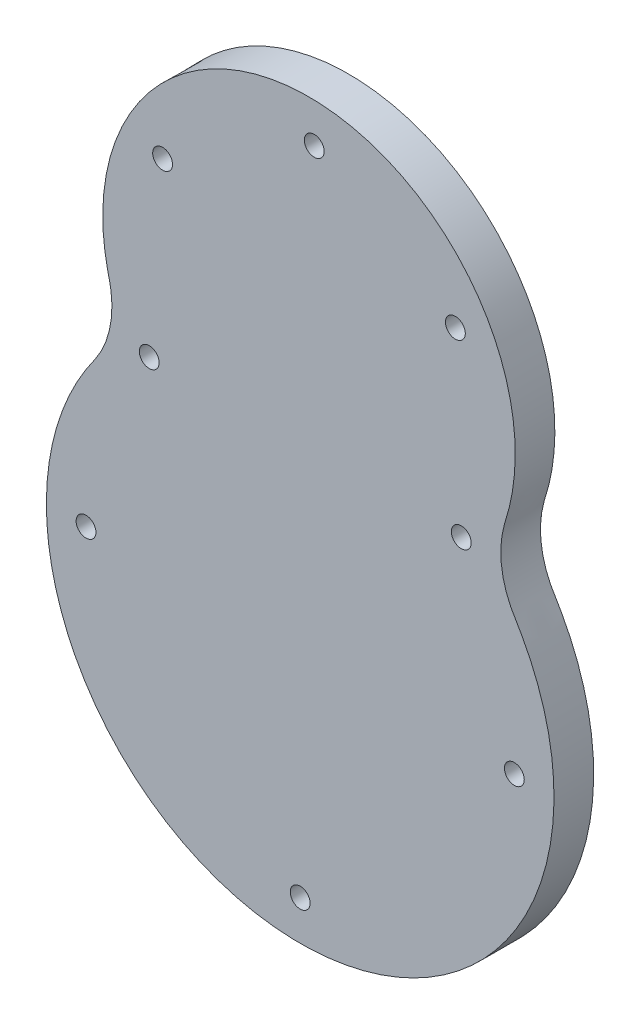
ISO-10303-21;
HEADER;
FILE_DESCRIPTION(('STEP AP214'),'2;1');
FILE_NAME('part.step','',(''),(''),'','','');
FILE_SCHEMA(('AUTOMOTIVE_DESIGN { 1 0 10303 214 1 1 1 1 }'));
ENDSEC;
DATA;
#1=APPLICATION_CONTEXT('core data for automotive mechanical design processes');
#2=APPLICATION_PROTOCOL_DEFINITION('international standard','automotive_design',2000,#1);
#3=PRODUCT_CONTEXT('',#1,'mechanical');
#4=PRODUCT('Part','Part','',(#3));
#5=PRODUCT_RELATED_PRODUCT_CATEGORY('part','',(#4));
#6=PRODUCT_DEFINITION_FORMATION('','',#4);
#7=PRODUCT_DEFINITION_CONTEXT('part definition',#1,'design');
#8=PRODUCT_DEFINITION('design','',#6,#7);
#9=PRODUCT_DEFINITION_SHAPE('','',#8);
#10=(LENGTH_UNIT() NAMED_UNIT(*) SI_UNIT(.MILLI.,.METRE.));
#11=(NAMED_UNIT(*) PLANE_ANGLE_UNIT() SI_UNIT($,.RADIAN.));
#12=(NAMED_UNIT(*) SI_UNIT($,.STERADIAN.) SOLID_ANGLE_UNIT());
#13=UNCERTAINTY_MEASURE_WITH_UNIT(LENGTH_MEASURE(1.E-05),#10,'distance_accuracy_value','');
#14=(GEOMETRIC_REPRESENTATION_CONTEXT(3) GLOBAL_UNCERTAINTY_ASSIGNED_CONTEXT((#13)) GLOBAL_UNIT_ASSIGNED_CONTEXT((#10,
#11,#12)) REPRESENTATION_CONTEXT('',''));
#15=CARTESIAN_POINT('',(0.,0.,0.));
#16=DIRECTION('',(0.,0.,1.));
#17=DIRECTION('',(1.,0.,0.));
#18=AXIS2_PLACEMENT_3D('',#15,#16,#17);
#19=CARTESIAN_POINT('',(-24.6240486254,31.2618380199474,-5.));
#20=CARTESIAN_POINT('',(-24.5397040259398,30.6784951706467,-5.));
#21=CARTESIAN_POINT('',(-24.3313424246882,29.5175456405578,-5.));
#22=CARTESIAN_POINT('',(-23.8786514280222,27.79635082914,-5.));
#23=CARTESIAN_POINT('',(-23.7566259843302,26.6206534172606,-5.));
#24=CARTESIAN_POINT('',(-23.7390192447413,26.0315075151196,-5.));
#25=CARTESIAN_POINT('',(-23.6865970494796,24.2773882266747,-5.));
#26=CARTESIAN_POINT('',(-24.0141490966971,22.5533255187044,-5.));
#27=CARTESIAN_POINT('',(-24.7062231400518,20.9406519363681,-5.));
#28=CARTESIAN_POINT('',(-24.9402306888359,20.3953666513398,-5.));
#29=CARTESIAN_POINT('',(-25.489135643883,19.3395097216286,-5.));
#30=CARTESIAN_POINT('',(-26.5488523080411,17.8945750841461,-5.));
#31=CARTESIAN_POINT('',(-27.1847624459491,16.89203322079,-5.));
#32=CARTESIAN_POINT('',(-27.4885398880624,16.3823128654779,-5.));
#33=CARTESIAN_POINT('',(-41.4946823949817,-7.11915546447077,-5.));
#34=CARTESIAN_POINT('',(-28.3582044985874,-31.1175718719185,-5.));
#35=CARTESIAN_POINT('',(-1.01336166800788,-31.983950633557,-5.));
#36=CARTESIAN_POINT('',(26.3314811625716,-32.8503293951955,-5.));
#37=CARTESIAN_POINT('',(40.9607915384507,-9.73162875017853,-5.));
#38=CARTESIAN_POINT('',(28.4704621158542,14.6093390305555,-5.));
#39=CARTESIAN_POINT('',(28.1995609507921,15.1372671826031,-5.));
#40=CARTESIAN_POINT('',(27.6283904847464,16.1780535151387,-5.));
#41=CARTESIAN_POINT('',(26.6622684472656,17.6871736970941,-5.));
#42=CARTESIAN_POINT('',(26.1813036823133,18.7756604450928,-5.));
#43=CARTESIAN_POINT('',(25.98228385416,19.3346655282166,-5.));
#44=CARTESIAN_POINT('',(25.3936855038354,20.987915220987,-5.));
#45=CARTESIAN_POINT('',(25.1759293432288,22.7292551703273,-5.));
#46=CARTESIAN_POINT('',(25.3392880049333,24.4765377783494,-5.));
#47=CARTESIAN_POINT('',(25.3941543340117,25.0633874841702,-5.));
#48=CARTESIAN_POINT('',(25.5903606070261,26.2290022196802,-5.));
#49=CARTESIAN_POINT('',(26.1511010345922,27.9180880346129,-5.));
#50=CARTESIAN_POINT('',(26.4325367133619,29.0635191006335,-5.));
#51=CARTESIAN_POINT('',(26.5536396957195,29.6403526632428,-5.));
#52=CARTESIAN_POINT('',(30.1365852487988,46.7065157566952,-5.));
#53=CARTESIAN_POINT('',(19.3611919394141,60.4171802408373,-5.));
#54=CARTESIAN_POINT('',(1.93172067964001,60.9694058952181,-5.));
#55=CARTESIAN_POINT('',(-15.4977505801341,61.5216315495989,-5.));
#56=CARTESIAN_POINT('',(-27.1194628726739,48.5205844779944,-5.));
#57=CARTESIAN_POINT('',(-24.6240486254,31.2618380199474,-5.));
#58=(BOUNDED_CURVE() B_SPLINE_CURVE(3,(#19,#20,#21,#22,#23,#24,#25,#26,#27,#28,#29,#30,#31,#32,
#33,#34,#35,#36,#37,#38,#39,#40,#41,#42,#43,#44,#45,#46,#47,#48,#49,#50,#51,#52,#53,#54,#55,#56,
#57),.UNSPECIFIED.,.T.,.F.) B_SPLINE_CURVE_WITH_KNOTS((4,1,1,3,3,1,1,3,3,3,1,1,3,3,1,1,3,3,4),
(0.,0.0079785106051653,0.0159570212103307,0.023935531815496,0.0473171494221339,
0.055349365736268,0.0633815820504022,0.0714137983645363,0.32020620084307,0.568998603321603,
0.577030819635737,0.585063035949871,0.593095252264006,0.616476869870644,0.624455380475809,
0.632433891080974,0.640412401686139,0.82020620084307,1.),
.UNSPECIFIED.) CURVE() GEOMETRIC_REPRESENTATION_ITEM() RATIONAL_B_SPLINE_CURVE((1.,1.,1.,1.,1.,
1.,0.984275021864804,0.984275021864804,1.,1.,1.,1.,1.,1.,0.671797986970852,0.671797986970852,1.,
0.671797986970852,0.671797986970852,1.,1.,1.,1.,1.,1.,0.984275021864804,0.984275021864804,1.,1.,
1.,1.,1.,1.,0.761671161603457,0.761671161603457,1.,0.761671161603457,0.761671161603457,1.)) REPRESENTATION_ITEM(''));
#59=DIRECTION('',(0.,0.,1.));
#60=VECTOR('',#59,1.);
#61=SURFACE_OF_LINEAR_EXTRUSION('',#58,#60);
#62=CARTESIAN_POINT('',(-24.6240486254,31.2618380199474,-5.));
#63=VERTEX_POINT('',#62);
#64=EDGE_CURVE('E12',#63,#63,#58,.T.);
#65=ORIENTED_EDGE('',*,*,#64,.T.);
#66=EDGE_LOOP('',(#65));
#67=FACE_BOUND('',#66,.T.);
#68=CARTESIAN_POINT('',(-24.6240486254,31.2618380199474,0.));
#69=CARTESIAN_POINT('',(-24.5397040259398,30.6784951706467,0.));
#70=CARTESIAN_POINT('',(-24.3313424246882,29.5175456405578,0.));
#71=CARTESIAN_POINT('',(-23.8786514280222,27.79635082914,0.));
#72=CARTESIAN_POINT('',(-23.7566259843302,26.6206534172606,0.));
#73=CARTESIAN_POINT('',(-23.7390192447413,26.0315075151196,0.));
#74=CARTESIAN_POINT('',(-23.6865970494796,24.2773882266747,0.));
#75=CARTESIAN_POINT('',(-24.0141490966971,22.5533255187044,0.));
#76=CARTESIAN_POINT('',(-24.7062231400518,20.9406519363681,0.));
#77=CARTESIAN_POINT('',(-24.9402306888359,20.3953666513398,0.));
#78=CARTESIAN_POINT('',(-25.489135643883,19.3395097216286,0.));
#79=CARTESIAN_POINT('',(-26.5488523080411,17.8945750841461,0.));
#80=CARTESIAN_POINT('',(-27.1847624459491,16.89203322079,0.));
#81=CARTESIAN_POINT('',(-27.4885398880624,16.3823128654779,0.));
#82=CARTESIAN_POINT('',(-41.4946823949817,-7.11915546447077,0.));
#83=CARTESIAN_POINT('',(-28.3582044985874,-31.1175718719185,0.));
#84=CARTESIAN_POINT('',(-1.01336166800788,-31.983950633557,0.));
#85=CARTESIAN_POINT('',(26.3314811625716,-32.8503293951955,0.));
#86=CARTESIAN_POINT('',(40.9607915384507,-9.73162875017853,0.));
#87=CARTESIAN_POINT('',(28.4704621158542,14.6093390305555,0.));
#88=CARTESIAN_POINT('',(28.1995609507921,15.1372671826031,0.));
#89=CARTESIAN_POINT('',(27.6283904847464,16.1780535151387,0.));
#90=CARTESIAN_POINT('',(26.6622684472656,17.6871736970941,0.));
#91=CARTESIAN_POINT('',(26.1813036823133,18.7756604450928,0.));
#92=CARTESIAN_POINT('',(25.98228385416,19.3346655282166,0.));
#93=CARTESIAN_POINT('',(25.3936855038354,20.987915220987,0.));
#94=CARTESIAN_POINT('',(25.1759293432288,22.7292551703273,0.));
#95=CARTESIAN_POINT('',(25.3392880049333,24.4765377783494,0.));
#96=CARTESIAN_POINT('',(25.3941543340117,25.0633874841702,0.));
#97=CARTESIAN_POINT('',(25.5903606070261,26.2290022196802,0.));
#98=CARTESIAN_POINT('',(26.1511010345922,27.9180880346129,0.));
#99=CARTESIAN_POINT('',(26.4325367133619,29.0635191006335,0.));
#100=CARTESIAN_POINT('',(26.5536396957195,29.6403526632428,0.));
#101=CARTESIAN_POINT('',(30.1365852487988,46.7065157566952,0.));
#102=CARTESIAN_POINT('',(19.3611919394141,60.4171802408373,0.));
#103=CARTESIAN_POINT('',(1.93172067964001,60.9694058952181,0.));
#104=CARTESIAN_POINT('',(-15.4977505801341,61.5216315495989,0.));
#105=CARTESIAN_POINT('',(-27.1194628726739,48.5205844779944,0.));
#106=CARTESIAN_POINT('',(-24.6240486254,31.2618380199474,0.));
#107=(BOUNDED_CURVE() B_SPLINE_CURVE(3,(#68,#69,#70,#71,#72,#73,#74,#75,#76,#77,#78,#79,#80,#81,
#82,#83,#84,#85,#86,#87,#88,#89,#90,#91,#92,#93,#94,#95,#96,#97,#98,#99,#100,#101,#102,#103,
#104,#105,#106),.UNSPECIFIED.,.T.,.F.) B_SPLINE_CURVE_WITH_KNOTS((4,1,1,3,3,1,1,3,3,3,1,1,3,3,1,
1,3,3,4),(0.,0.0079785106051653,0.0159570212103307,0.023935531815496,0.0473171494221339,
0.055349365736268,0.0633815820504022,0.0714137983645363,0.32020620084307,0.568998603321603,
0.577030819635737,0.585063035949871,0.593095252264006,0.616476869870644,0.624455380475809,
0.632433891080974,0.640412401686139,0.82020620084307,1.),
.UNSPECIFIED.) CURVE() GEOMETRIC_REPRESENTATION_ITEM() RATIONAL_B_SPLINE_CURVE((1.,1.,1.,1.,1.,
1.,0.984275021864804,0.984275021864804,1.,1.,1.,1.,1.,1.,0.671797986970852,0.671797986970852,1.,
0.671797986970852,0.671797986970852,1.,1.,1.,1.,1.,1.,0.984275021864804,0.984275021864804,1.,1.,
1.,1.,1.,1.,0.761671161603457,0.761671161603457,1.,0.761671161603457,0.761671161603457,1.)) REPRESENTATION_ITEM(''));
#108=CARTESIAN_POINT('',(-24.6240486254,31.2618380199474,0.));
#109=VERTEX_POINT('',#108);
#110=EDGE_CURVE('E54',#109,#109,#107,.T.);
#111=ORIENTED_EDGE('',*,*,#110,.F.);
#112=EDGE_LOOP('',(#111));
#113=FACE_BOUND('',#112,.T.);
#114=ADVANCED_FACE('F50',(#67,#113),#61,.T.);
#115=CARTESIAN_POINT('',(31.9307239755024,-2.10448720601429,-5.));
#116=DIRECTION('',(0.,0.,1.));
#117=DIRECTION('',(1.,0.,0.));
#118=AXIS2_PLACEMENT_3D('',#115,#116,#117);
#119=PLANE('',#118);
#120=CARTESIAN_POINT('',(1.77338291901378,55.9719136087248,-5.));
#121=DIRECTION('',(0.,0.,1.));
#122=DIRECTION('',(1.,0.,0.));
#123=AXIS2_PLACEMENT_3D('',#120,#121,#122);
#124=CIRCLE('',#123,1.25);
#125=CARTESIAN_POINT('',(3.02338291901378,55.9719136087248,-5.));
#126=VERTEX_POINT('',#125);
#127=EDGE_CURVE('E128',#126,#126,#124,.T.);
#128=ORIENTED_EDGE('',*,*,#127,.T.);
#129=EDGE_LOOP('',(#128));
#130=FACE_BOUND('',#129,.T.);
#131=CARTESIAN_POINT('',(19.5650328202508,45.,-5.));
#132=DIRECTION('',(0.,0.,1.));
#133=DIRECTION('',(1.,0.,0.));
#134=AXIS2_PLACEMENT_3D('',#131,#132,#133);
#135=CIRCLE('',#134,1.25);
#136=CARTESIAN_POINT('',(20.8150328202508,45.,-5.));
#137=VERTEX_POINT('',#136);
#138=EDGE_CURVE('E120',#137,#137,#135,.T.);
#139=ORIENTED_EDGE('',*,*,#138,.T.);
#140=EDGE_LOOP('',(#139));
#141=FACE_BOUND('',#140,.T.);
#142=CARTESIAN_POINT('',(20.308924933209,22.5,-5.));
#143=DIRECTION('',(0.,0.,1.));
#144=DIRECTION('',(1.,0.,0.));
#145=AXIS2_PLACEMENT_3D('',#142,#143,#144);
#146=CIRCLE('',#145,1.25);
#147=CARTESIAN_POINT('',(21.558924933209,22.5,-5.));
#148=VERTEX_POINT('',#147);
#149=EDGE_CURVE('E112',#148,#148,#146,.T.);
#150=ORIENTED_EDGE('',*,*,#149,.T.);
#151=EDGE_LOOP('',(#150));
#152=FACE_BOUND('',#151,.T.);
#153=CARTESIAN_POINT('',(27.,0.,-5.));
#154=DIRECTION('',(0.,0.,1.));
#155=DIRECTION('',(1.,0.,0.));
#156=AXIS2_PLACEMENT_3D('',#153,#154,#155);
#157=CIRCLE('',#156,1.25);
#158=CARTESIAN_POINT('',(28.25,0.,-5.));
#159=VERTEX_POINT('',#158);
#160=EDGE_CURVE('E104',#159,#159,#157,.T.);
#161=ORIENTED_EDGE('',*,*,#160,.T.);
#162=EDGE_LOOP('',(#161));
#163=FACE_BOUND('',#162,.T.);
#164=CARTESIAN_POINT('',(2.83030977127341E-13,-27.,-5.));
#165=DIRECTION('',(0.,0.,1.));
#166=DIRECTION('',(1.,0.,0.));
#167=AXIS2_PLACEMENT_3D('',#164,#165,#166);
#168=CIRCLE('',#167,1.25);
#169=CARTESIAN_POINT('',(1.25000000000028,-27.,-5.));
#170=VERTEX_POINT('',#169);
#171=EDGE_CURVE('E96',#170,#170,#168,.T.);
#172=ORIENTED_EDGE('',*,*,#171,.T.);
#173=EDGE_LOOP('',(#172));
#174=FACE_BOUND('',#173,.T.);
#175=CARTESIAN_POINT('',(-27.,-1.99401720179029E-13,-5.));
#176=DIRECTION('',(0.,0.,1.));
#177=DIRECTION('',(1.,0.,0.));
#178=AXIS2_PLACEMENT_3D('',#175,#176,#177);
#179=CIRCLE('',#178,1.25);
#180=CARTESIAN_POINT('',(-25.75,-1.99401720179029E-13,-5.));
#181=VERTEX_POINT('',#180);
#182=EDGE_CURVE('E88',#181,#181,#179,.T.);
#183=ORIENTED_EDGE('',*,*,#182,.T.);
#184=EDGE_LOOP('',(#183));
#185=FACE_BOUND('',#184,.T.);
#186=CARTESIAN_POINT('',(-19.0324131119325,22.5,-5.));
#187=DIRECTION('',(0.,0.,1.));
#188=DIRECTION('',(1.,0.,0.));
#189=AXIS2_PLACEMENT_3D('',#186,#187,#188);
#190=CIRCLE('',#189,1.25);
#191=CARTESIAN_POINT('',(-17.7824131119325,22.5,-5.));
#192=VERTEX_POINT('',#191);
#193=EDGE_CURVE('E80',#192,#192,#190,.T.);
#194=ORIENTED_EDGE('',*,*,#193,.T.);
#195=EDGE_LOOP('',(#194));
#196=FACE_BOUND('',#195,.T.);
#197=CARTESIAN_POINT('',(-17.3483041714836,45.,-5.));
#198=DIRECTION('',(0.,0.,1.));
#199=DIRECTION('',(1.,0.,0.));
#200=AXIS2_PLACEMENT_3D('',#197,#198,#199);
#201=CIRCLE('',#200,1.25);
#202=CARTESIAN_POINT('',(-16.0983041714836,45.,-5.));
#203=VERTEX_POINT('',#202);
#204=EDGE_CURVE('E65',#203,#203,#201,.T.);
#205=ORIENTED_EDGE('',*,*,#204,.T.);
#206=EDGE_LOOP('',(#205));
#207=FACE_BOUND('',#206,.T.);
#208=ORIENTED_EDGE('',*,*,#64,.F.);
#209=EDGE_LOOP('',(#208));
#210=FACE_BOUND('',#209,.T.);
#211=ADVANCED_FACE('F144',(#130,#141,#152,#163,#174,#185,#196,#207,#210),#119,.F.);
#212=CARTESIAN_POINT('',(31.9307239755024,-2.10448720601429,0.));
#213=DIRECTION('',(0.,0.,1.));
#214=DIRECTION('',(1.,0.,0.));
#215=AXIS2_PLACEMENT_3D('',#212,#213,#214);
#216=PLANE('',#215);
#217=CARTESIAN_POINT('',(1.77338291901378,55.9719136087248,0.));
#218=DIRECTION('',(0.,0.,1.));
#219=DIRECTION('',(1.,0.,0.));
#220=AXIS2_PLACEMENT_3D('',#217,#218,#219);
#221=CIRCLE('',#220,1.24999999999999);
#222=CARTESIAN_POINT('',(3.02338291901377,55.9719136087248,0.));
#223=VERTEX_POINT('',#222);
#224=EDGE_CURVE('E132',#223,#223,#221,.T.);
#225=ORIENTED_EDGE('',*,*,#224,.F.);
#226=EDGE_LOOP('',(#225));
#227=FACE_BOUND('',#226,.T.);
#228=CARTESIAN_POINT('',(19.5650328202508,45.,0.));
#229=DIRECTION('',(0.,0.,1.));
#230=DIRECTION('',(1.,0.,0.));
#231=AXIS2_PLACEMENT_3D('',#228,#229,#230);
#232=CIRCLE('',#231,1.24999999999999);
#233=CARTESIAN_POINT('',(20.8150328202507,45.,0.));
#234=VERTEX_POINT('',#233);
#235=EDGE_CURVE('E124',#234,#234,#232,.T.);
#236=ORIENTED_EDGE('',*,*,#235,.F.);
#237=EDGE_LOOP('',(#236));
#238=FACE_BOUND('',#237,.T.);
#239=CARTESIAN_POINT('',(20.308924933209,22.5,0.));
#240=DIRECTION('',(0.,0.,1.));
#241=DIRECTION('',(1.,0.,0.));
#242=AXIS2_PLACEMENT_3D('',#239,#240,#241);
#243=CIRCLE('',#242,1.24999999999999);
#244=CARTESIAN_POINT('',(21.558924933209,22.5,0.));
#245=VERTEX_POINT('',#244);
#246=EDGE_CURVE('E116',#245,#245,#243,.T.);
#247=ORIENTED_EDGE('',*,*,#246,.F.);
#248=EDGE_LOOP('',(#247));
#249=FACE_BOUND('',#248,.T.);
#250=CARTESIAN_POINT('',(27.,0.,0.));
#251=DIRECTION('',(0.,0.,1.));
#252=DIRECTION('',(1.,0.,0.));
#253=AXIS2_PLACEMENT_3D('',#250,#251,#252);
#254=CIRCLE('',#253,1.24999999999999);
#255=CARTESIAN_POINT('',(28.25,0.,0.));
#256=VERTEX_POINT('',#255);
#257=EDGE_CURVE('E108',#256,#256,#254,.T.);
#258=ORIENTED_EDGE('',*,*,#257,.F.);
#259=EDGE_LOOP('',(#258));
#260=FACE_BOUND('',#259,.T.);
#261=CARTESIAN_POINT('',(2.83030977127341E-13,-27.,0.));
#262=DIRECTION('',(0.,0.,1.));
#263=DIRECTION('',(1.,0.,0.));
#264=AXIS2_PLACEMENT_3D('',#261,#262,#263);
#265=CIRCLE('',#264,1.24999999999999);
#266=CARTESIAN_POINT('',(1.25000000000027,-27.,0.));
#267=VERTEX_POINT('',#266);
#268=EDGE_CURVE('E100',#267,#267,#265,.T.);
#269=ORIENTED_EDGE('',*,*,#268,.F.);
#270=EDGE_LOOP('',(#269));
#271=FACE_BOUND('',#270,.T.);
#272=CARTESIAN_POINT('',(-27.,-1.99401720179029E-13,0.));
#273=DIRECTION('',(0.,0.,1.));
#274=DIRECTION('',(1.,0.,0.));
#275=AXIS2_PLACEMENT_3D('',#272,#273,#274);
#276=CIRCLE('',#275,1.24999999999999);
#277=CARTESIAN_POINT('',(-25.75,-1.99401720179029E-13,0.));
#278=VERTEX_POINT('',#277);
#279=EDGE_CURVE('E92',#278,#278,#276,.T.);
#280=ORIENTED_EDGE('',*,*,#279,.F.);
#281=EDGE_LOOP('',(#280));
#282=FACE_BOUND('',#281,.T.);
#283=CARTESIAN_POINT('',(-19.0324131119325,22.5,0.));
#284=DIRECTION('',(0.,0.,1.));
#285=DIRECTION('',(1.,0.,0.));
#286=AXIS2_PLACEMENT_3D('',#283,#284,#285);
#287=CIRCLE('',#286,1.24999999999999);
#288=CARTESIAN_POINT('',(-17.7824131119325,22.5,0.));
#289=VERTEX_POINT('',#288);
#290=EDGE_CURVE('E84',#289,#289,#287,.T.);
#291=ORIENTED_EDGE('',*,*,#290,.F.);
#292=EDGE_LOOP('',(#291));
#293=FACE_BOUND('',#292,.T.);
#294=CARTESIAN_POINT('',(-17.3483041714836,45.,0.));
#295=DIRECTION('',(0.,0.,1.));
#296=DIRECTION('',(1.,0.,0.));
#297=AXIS2_PLACEMENT_3D('',#294,#295,#296);
#298=CIRCLE('',#297,1.24999999999999);
#299=CARTESIAN_POINT('',(-16.0983041714836,45.,0.));
#300=VERTEX_POINT('',#299);
#301=EDGE_CURVE('E76',#300,#300,#298,.T.);
#302=ORIENTED_EDGE('',*,*,#301,.F.);
#303=EDGE_LOOP('',(#302));
#304=FACE_BOUND('',#303,.T.);
#305=ORIENTED_EDGE('',*,*,#110,.T.);
#306=EDGE_LOOP('',(#305));
#307=FACE_BOUND('',#306,.T.);
#308=ADVANCED_FACE('F140',(#227,#238,#249,#260,#271,#282,#293,#304,#307),#216,.T.);
#309=CARTESIAN_POINT('',(-17.3483041714836,45.,0.));
#310=DIRECTION('',(0.,0.,1.));
#311=DIRECTION('',(1.,0.,0.));
#312=AXIS2_PLACEMENT_3D('',#309,#310,#311);
#313=CYLINDRICAL_SURFACE('',#312,1.24999999999999);
#314=ORIENTED_EDGE('',*,*,#204,.F.);
#315=EDGE_LOOP('',(#314));
#316=FACE_BOUND('',#315,.T.);
#317=ORIENTED_EDGE('',*,*,#301,.T.);
#318=EDGE_LOOP('',(#317));
#319=FACE_BOUND('',#318,.T.);
#320=ADVANCED_FACE('F143',(#316,#319),#313,.F.);
#321=CARTESIAN_POINT('',(-19.0324131119325,22.5,0.));
#322=DIRECTION('',(0.,0.,1.));
#323=DIRECTION('',(1.,0.,0.));
#324=AXIS2_PLACEMENT_3D('',#321,#322,#323);
#325=CYLINDRICAL_SURFACE('',#324,1.24999999999999);
#326=ORIENTED_EDGE('',*,*,#193,.F.);
#327=EDGE_LOOP('',(#326));
#328=FACE_BOUND('',#327,.T.);
#329=ORIENTED_EDGE('',*,*,#290,.T.);
#330=EDGE_LOOP('',(#329));
#331=FACE_BOUND('',#330,.T.);
#332=ADVANCED_FACE('F173',(#328,#331),#325,.F.);
#333=CARTESIAN_POINT('',(-27.,-1.99401720179029E-13,0.));
#334=DIRECTION('',(0.,0.,1.));
#335=DIRECTION('',(1.,0.,0.));
#336=AXIS2_PLACEMENT_3D('',#333,#334,#335);
#337=CYLINDRICAL_SURFACE('',#336,1.24999999999999);
#338=ORIENTED_EDGE('',*,*,#182,.F.);
#339=EDGE_LOOP('',(#338));
#340=FACE_BOUND('',#339,.T.);
#341=ORIENTED_EDGE('',*,*,#279,.T.);
#342=EDGE_LOOP('',(#341));
#343=FACE_BOUND('',#342,.T.);
#344=ADVANCED_FACE('F177',(#340,#343),#337,.F.);
#345=CARTESIAN_POINT('',(2.83030977127341E-13,-27.,0.));
#346=DIRECTION('',(0.,0.,1.));
#347=DIRECTION('',(1.,0.,0.));
#348=AXIS2_PLACEMENT_3D('',#345,#346,#347);
#349=CYLINDRICAL_SURFACE('',#348,1.24999999999999);
#350=ORIENTED_EDGE('',*,*,#171,.F.);
#351=EDGE_LOOP('',(#350));
#352=FACE_BOUND('',#351,.T.);
#353=ORIENTED_EDGE('',*,*,#268,.T.);
#354=EDGE_LOOP('',(#353));
#355=FACE_BOUND('',#354,.T.);
#356=ADVANCED_FACE('F181',(#352,#355),#349,.F.);
#357=CARTESIAN_POINT('',(27.,0.,0.));
#358=DIRECTION('',(0.,0.,1.));
#359=DIRECTION('',(1.,0.,0.));
#360=AXIS2_PLACEMENT_3D('',#357,#358,#359);
#361=CYLINDRICAL_SURFACE('',#360,1.24999999999999);
#362=ORIENTED_EDGE('',*,*,#160,.F.);
#363=EDGE_LOOP('',(#362));
#364=FACE_BOUND('',#363,.T.);
#365=ORIENTED_EDGE('',*,*,#257,.T.);
#366=EDGE_LOOP('',(#365));
#367=FACE_BOUND('',#366,.T.);
#368=ADVANCED_FACE('F185',(#364,#367),#361,.F.);
#369=CARTESIAN_POINT('',(20.308924933209,22.5,0.));
#370=DIRECTION('',(0.,0.,1.));
#371=DIRECTION('',(1.,0.,0.));
#372=AXIS2_PLACEMENT_3D('',#369,#370,#371);
#373=CYLINDRICAL_SURFACE('',#372,1.24999999999999);
#374=ORIENTED_EDGE('',*,*,#149,.F.);
#375=EDGE_LOOP('',(#374));
#376=FACE_BOUND('',#375,.T.);
#377=ORIENTED_EDGE('',*,*,#246,.T.);
#378=EDGE_LOOP('',(#377));
#379=FACE_BOUND('',#378,.T.);
#380=ADVANCED_FACE('F189',(#376,#379),#373,.F.);
#381=CARTESIAN_POINT('',(19.5650328202508,45.,0.));
#382=DIRECTION('',(0.,0.,1.));
#383=DIRECTION('',(1.,0.,0.));
#384=AXIS2_PLACEMENT_3D('',#381,#382,#383);
#385=CYLINDRICAL_SURFACE('',#384,1.24999999999999);
#386=ORIENTED_EDGE('',*,*,#138,.F.);
#387=EDGE_LOOP('',(#386));
#388=FACE_BOUND('',#387,.T.);
#389=ORIENTED_EDGE('',*,*,#235,.T.);
#390=EDGE_LOOP('',(#389));
#391=FACE_BOUND('',#390,.T.);
#392=ADVANCED_FACE('F193',(#388,#391),#385,.F.);
#393=CARTESIAN_POINT('',(1.77338291901378,55.9719136087248,0.));
#394=DIRECTION('',(0.,0.,1.));
#395=DIRECTION('',(1.,0.,0.));
#396=AXIS2_PLACEMENT_3D('',#393,#394,#395);
#397=CYLINDRICAL_SURFACE('',#396,1.24999999999999);
#398=ORIENTED_EDGE('',*,*,#127,.F.);
#399=EDGE_LOOP('',(#398));
#400=FACE_BOUND('',#399,.T.);
#401=ORIENTED_EDGE('',*,*,#224,.T.);
#402=EDGE_LOOP('',(#401));
#403=FACE_BOUND('',#402,.T.);
#404=ADVANCED_FACE('F138',(#400,#403),#397,.F.);
#405=CLOSED_SHELL('',(#114,#211,#308,#320,#332,#344,#356,#368,#380,#392,#404));
#406=MANIFOLD_SOLID_BREP('B2',#405);
#407=ADVANCED_BREP_SHAPE_REPRESENTATION('',(#18,#406),#14);
#408=SHAPE_DEFINITION_REPRESENTATION(#9,#407);
ENDSEC;
END-ISO-10303-21;
